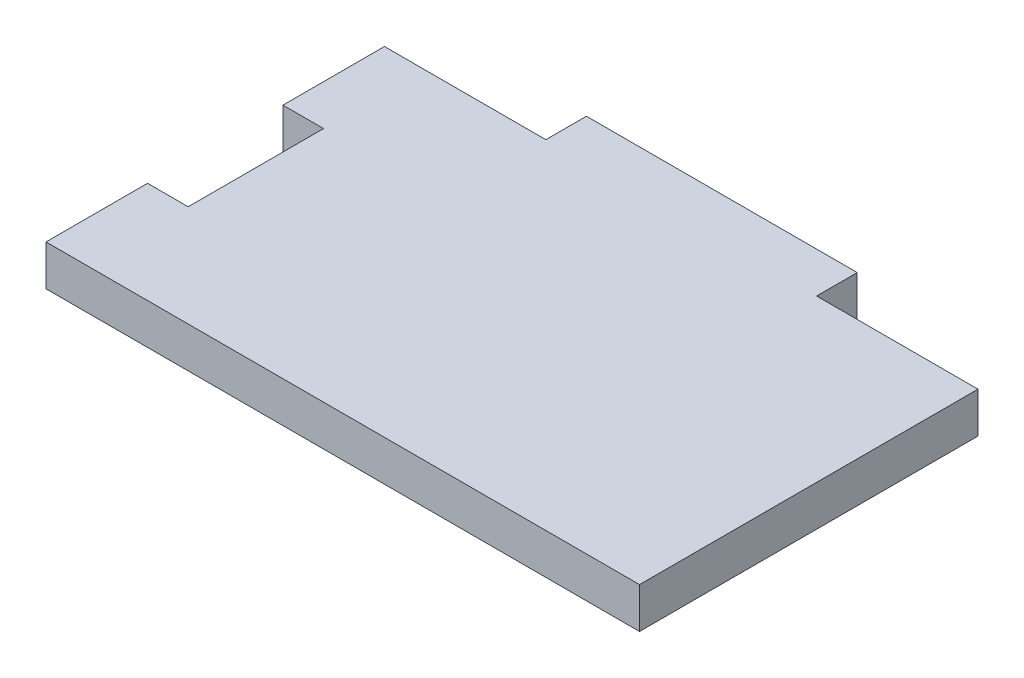
ISO-10303-21;
HEADER;
FILE_DESCRIPTION(('STEP AP214'),'2;1');
FILE_NAME('part.step','',(''),(''),'','','');
FILE_SCHEMA(('AUTOMOTIVE_DESIGN { 1 0 10303 214 1 1 1 1 }'));
ENDSEC;
DATA;
#1=APPLICATION_CONTEXT('core data for automotive mechanical design processes');
#2=APPLICATION_PROTOCOL_DEFINITION('international standard','automotive_design',2000,#1);
#3=PRODUCT_CONTEXT('',#1,'mechanical');
#4=PRODUCT('Part','Part','',(#3));
#5=PRODUCT_RELATED_PRODUCT_CATEGORY('part','',(#4));
#6=PRODUCT_DEFINITION_FORMATION('','',#4);
#7=PRODUCT_DEFINITION_CONTEXT('part definition',#1,'design');
#8=PRODUCT_DEFINITION('design','',#6,#7);
#9=PRODUCT_DEFINITION_SHAPE('','',#8);
#10=(LENGTH_UNIT() NAMED_UNIT(*) SI_UNIT(.MILLI.,.METRE.));
#11=(NAMED_UNIT(*) PLANE_ANGLE_UNIT() SI_UNIT($,.RADIAN.));
#12=(NAMED_UNIT(*) SI_UNIT($,.STERADIAN.) SOLID_ANGLE_UNIT());
#13=UNCERTAINTY_MEASURE_WITH_UNIT(LENGTH_MEASURE(1.E-05),#10,'distance_accuracy_value','');
#14=(GEOMETRIC_REPRESENTATION_CONTEXT(3) GLOBAL_UNCERTAINTY_ASSIGNED_CONTEXT((#13)) GLOBAL_UNIT_ASSIGNED_CONTEXT((#10,
#11,#12)) REPRESENTATION_CONTEXT('',''));
#15=CARTESIAN_POINT('',(0.,0.,0.));
#16=DIRECTION('',(0.,0.,1.));
#17=DIRECTION('',(1.,0.,0.));
#18=AXIS2_PLACEMENT_3D('',#15,#16,#17);
#19=CARTESIAN_POINT('',(-54.8558581563153,0.,50.));
#20=DIRECTION('',(-1.,0.,0.));
#21=DIRECTION('',(0.,0.,1.));
#22=AXIS2_PLACEMENT_3D('',#19,#20,#21);
#23=PLANE('',#22);
#24=DIRECTION('',(0.,1.,0.));
#25=VECTOR('',#24,1.);
#26=CARTESIAN_POINT('',(-54.8558581563153,-41.008278223877,15.));
#27=LINE('',#26,#25);
#28=CARTESIAN_POINT('',(-54.8558581563153,-41.008278223877,15.));
#29=VERTEX_POINT('',#28);
#30=CARTESIAN_POINT('',(-54.8558581563153,-35.008278223877,15.));
#31=VERTEX_POINT('',#30);
#32=EDGE_CURVE('E171',#29,#31,#27,.T.);
#33=ORIENTED_EDGE('',*,*,#32,.T.);
#34=DIRECTION('',(0.,0.,-1.));
#35=VECTOR('',#34,1.);
#36=CARTESIAN_POINT('',(-54.8558581563153,-35.008278223877,50.));
#37=LINE('',#36,#35);
#38=CARTESIAN_POINT('',(-54.8558581563153,-35.008278223877,0.));
#39=VERTEX_POINT('',#38);
#40=EDGE_CURVE('E246',#31,#39,#37,.T.);
#41=ORIENTED_EDGE('',*,*,#40,.T.);
#42=DIRECTION('',(0.,1.,0.));
#43=VECTOR('',#42,1.);
#44=CARTESIAN_POINT('',(-54.8558581563153,0.,0.));
#45=LINE('',#44,#43);
#46=CARTESIAN_POINT('',(-54.8558581563153,-41.008278223877,0.));
#47=VERTEX_POINT('',#46);
#48=EDGE_CURVE('E216',#47,#39,#45,.T.);
#49=ORIENTED_EDGE('',*,*,#48,.F.);
#50=DIRECTION('',(0.,0.,-1.));
#51=VECTOR('',#50,1.);
#52=CARTESIAN_POINT('',(-54.8558581563153,-41.008278223877,50.));
#53=LINE('',#52,#51);
#54=EDGE_CURVE('E227',#29,#47,#53,.T.);
#55=ORIENTED_EDGE('',*,*,#54,.F.);
#56=EDGE_LOOP('',(#33,#41,#49,#55));
#57=FACE_BOUND('',#56,.T.);
#58=ADVANCED_FACE('F45',(#57),#23,.T.);
#59=CARTESIAN_POINT('',(0.,0.,0.));
#60=DIRECTION('',(0.,0.,1.));
#61=DIRECTION('',(1.,0.,0.));
#62=AXIS2_PLACEMENT_3D('',#59,#60,#61);
#63=PLANE('',#62);
#64=DIRECTION('',(0.,-1.,0.));
#65=VECTOR('',#64,1.);
#66=CARTESIAN_POINT('',(8.98173698355886,0.,0.));
#67=LINE('',#66,#65);
#68=CARTESIAN_POINT('',(8.98173698355886,-35.008278223877,0.));
#69=VERTEX_POINT('',#68);
#70=CARTESIAN_POINT('',(8.98173698355886,-41.008278223877,0.));
#71=VERTEX_POINT('',#70);
#72=EDGE_CURVE('E175',#69,#71,#67,.T.);
#73=ORIENTED_EDGE('',*,*,#72,.F.);
#74=DIRECTION('',(1.,0.,0.));
#75=VECTOR('',#74,1.);
#76=CARTESIAN_POINT('',(0.,-35.008278223877,0.));
#77=LINE('',#76,#75);
#78=CARTESIAN_POINT('',(32.819332123433,-35.008278223877,0.));
#79=VERTEX_POINT('',#78);
#80=EDGE_CURVE('E236',#69,#79,#77,.T.);
#81=ORIENTED_EDGE('',*,*,#80,.T.);
#82=DIRECTION('',(0.,1.,0.));
#83=VECTOR('',#82,1.);
#84=CARTESIAN_POINT('',(32.819332123433,0.,0.));
#85=LINE('',#84,#83);
#86=CARTESIAN_POINT('',(32.819332123433,-41.008278223877,0.));
#87=VERTEX_POINT('',#86);
#88=EDGE_CURVE('E232',#87,#79,#85,.T.);
#89=ORIENTED_EDGE('',*,*,#88,.F.);
#90=DIRECTION('',(1.,0.,0.));
#91=VECTOR('',#90,1.);
#92=CARTESIAN_POINT('',(0.,-41.008278223877,0.));
#93=LINE('',#92,#91);
#94=EDGE_CURVE('E203',#71,#87,#93,.T.);
#95=ORIENTED_EDGE('',*,*,#94,.F.);
#96=EDGE_LOOP('',(#73,#81,#89,#95));
#97=FACE_BOUND('',#96,.T.);
#98=ADVANCED_FACE('F266',(#97),#63,.F.);
#99=CARTESIAN_POINT('',(0.,-41.008278223877,50.));
#100=DIRECTION('',(0.,1.,0.));
#101=DIRECTION('',(0.,0.,1.));
#102=AXIS2_PLACEMENT_3D('',#99,#100,#101);
#103=PLANE('',#102);
#104=DIRECTION('',(0.,0.,-1.));
#105=VECTOR('',#104,1.);
#106=CARTESIAN_POINT('',(-48.8558581563153,-41.008278223877,15.));
#107=LINE('',#106,#105);
#108=CARTESIAN_POINT('',(-48.8558581563153,-41.008278223877,35.));
#109=VERTEX_POINT('',#108);
#110=CARTESIAN_POINT('',(-48.8558581563153,-41.008278223877,15.));
#111=VERTEX_POINT('',#110);
#112=EDGE_CURVE('E147',#109,#111,#107,.T.);
#113=ORIENTED_EDGE('',*,*,#112,.T.);
#114=DIRECTION('',(-1.,0.,0.));
#115=VECTOR('',#114,1.);
#116=CARTESIAN_POINT('',(-54.8558581563153,-41.008278223877,15.));
#117=LINE('',#116,#115);
#118=EDGE_CURVE('E153',#111,#29,#117,.T.);
#119=ORIENTED_EDGE('',*,*,#118,.T.);
#120=ORIENTED_EDGE('',*,*,#54,.T.);
#121=CARTESIAN_POINT('',(-31.0182630164411,-41.008278223877,0.));
#122=VERTEX_POINT('',#121);
#123=EDGE_CURVE('E228',#47,#122,#93,.T.);
#124=ORIENTED_EDGE('',*,*,#123,.T.);
#125=DIRECTION('',(0.,0.,1.));
#126=VECTOR('',#125,1.);
#127=CARTESIAN_POINT('',(-31.0182630164411,-41.008278223877,-6.));
#128=LINE('',#127,#126);
#129=CARTESIAN_POINT('',(-31.0182630164411,-41.008278223877,-6.));
#130=VERTEX_POINT('',#129);
#131=EDGE_CURVE('E69',#130,#122,#128,.T.);
#132=ORIENTED_EDGE('',*,*,#131,.F.);
#133=DIRECTION('',(1.,0.,0.));
#134=VECTOR('',#133,1.);
#135=CARTESIAN_POINT('',(0.,-41.008278223877,-6.));
#136=LINE('',#135,#134);
#137=CARTESIAN_POINT('',(8.98173698355886,-41.008278223877,-6.));
#138=VERTEX_POINT('',#137);
#139=EDGE_CURVE('E190',#130,#138,#136,.T.);
#140=ORIENTED_EDGE('',*,*,#139,.T.);
#141=DIRECTION('',(0.,0.,1.));
#142=VECTOR('',#141,1.);
#143=CARTESIAN_POINT('',(8.98173698355886,-41.008278223877,-6.));
#144=LINE('',#143,#142);
#145=EDGE_CURVE('E200',#138,#71,#144,.T.);
#146=ORIENTED_EDGE('',*,*,#145,.T.);
#147=ORIENTED_EDGE('',*,*,#94,.T.);
#148=DIRECTION('',(0.,0.,-1.));
#149=VECTOR('',#148,1.);
#150=CARTESIAN_POINT('',(32.819332123433,-41.008278223877,50.));
#151=LINE('',#150,#149);
#152=CARTESIAN_POINT('',(32.819332123433,-41.008278223877,50.));
#153=VERTEX_POINT('',#152);
#154=EDGE_CURVE('E11',#153,#87,#151,.T.);
#155=ORIENTED_EDGE('',*,*,#154,.F.);
#156=DIRECTION('',(1.,0.,0.));
#157=VECTOR('',#156,1.);
#158=CARTESIAN_POINT('',(0.,-41.008278223877,50.));
#159=LINE('',#158,#157);
#160=CARTESIAN_POINT('',(-54.8558581563153,-41.008278223877,50.));
#161=VERTEX_POINT('',#160);
#162=EDGE_CURVE('E211',#161,#153,#159,.T.);
#163=ORIENTED_EDGE('',*,*,#162,.F.);
#164=CARTESIAN_POINT('',(-54.8558581563153,-41.008278223877,35.));
#165=VERTEX_POINT('',#164);
#166=EDGE_CURVE('E157',#161,#165,#53,.T.);
#167=ORIENTED_EDGE('',*,*,#166,.T.);
#168=DIRECTION('',(1.,0.,0.));
#169=VECTOR('',#168,1.);
#170=CARTESIAN_POINT('',(-54.8558581563153,-41.008278223877,35.));
#171=LINE('',#170,#169);
#172=EDGE_CURVE('E61',#165,#109,#171,.T.);
#173=ORIENTED_EDGE('',*,*,#172,.T.);
#174=EDGE_LOOP('',(#113,#119,#120,#124,#132,#140,#146,#147,#155,#163,#167,#173));
#175=FACE_BOUND('',#174,.T.);
#176=ADVANCED_FACE('F47',(#175),#103,.F.);
#177=CARTESIAN_POINT('',(32.819332123433,0.,50.));
#178=DIRECTION('',(-1.,0.,0.));
#179=DIRECTION('',(0.,0.,1.));
#180=AXIS2_PLACEMENT_3D('',#177,#178,#179);
#181=PLANE('',#180);
#182=ORIENTED_EDGE('',*,*,#88,.T.);
#183=DIRECTION('',(0.,0.,-1.));
#184=VECTOR('',#183,1.);
#185=CARTESIAN_POINT('',(32.819332123433,-35.008278223877,50.));
#186=LINE('',#185,#184);
#187=CARTESIAN_POINT('',(32.819332123433,-35.008278223877,50.));
#188=VERTEX_POINT('',#187);
#189=EDGE_CURVE('E54',#188,#79,#186,.T.);
#190=ORIENTED_EDGE('',*,*,#189,.F.);
#191=DIRECTION('',(0.,1.,0.));
#192=VECTOR('',#191,1.);
#193=CARTESIAN_POINT('',(32.819332123433,0.,50.));
#194=LINE('',#193,#192);
#195=EDGE_CURVE('E215',#153,#188,#194,.T.);
#196=ORIENTED_EDGE('',*,*,#195,.F.);
#197=ORIENTED_EDGE('',*,*,#154,.T.);
#198=EDGE_LOOP('',(#182,#190,#196,#197));
#199=FACE_BOUND('',#198,.T.);
#200=ADVANCED_FACE('F261',(#199),#181,.F.);
#201=CARTESIAN_POINT('',(0.,-35.008278223877,50.));
#202=DIRECTION('',(0.,1.,0.));
#203=DIRECTION('',(0.,0.,1.));
#204=AXIS2_PLACEMENT_3D('',#201,#202,#203);
#205=PLANE('',#204);
#206=DIRECTION('',(-1.,0.,0.));
#207=VECTOR('',#206,1.);
#208=CARTESIAN_POINT('',(-54.8558581563153,-35.008278223877,15.));
#209=LINE('',#208,#207);
#210=CARTESIAN_POINT('',(-48.8558581563153,-35.008278223877,15.));
#211=VERTEX_POINT('',#210);
#212=EDGE_CURVE('E159',#211,#31,#209,.T.);
#213=ORIENTED_EDGE('',*,*,#212,.F.);
#214=DIRECTION('',(0.,0.,-1.));
#215=VECTOR('',#214,1.);
#216=CARTESIAN_POINT('',(-48.8558581563153,-35.008278223877,15.));
#217=LINE('',#216,#215);
#218=CARTESIAN_POINT('',(-48.8558581563153,-35.008278223877,35.));
#219=VERTEX_POINT('',#218);
#220=EDGE_CURVE('E162',#219,#211,#217,.T.);
#221=ORIENTED_EDGE('',*,*,#220,.F.);
#222=DIRECTION('',(1.,0.,0.));
#223=VECTOR('',#222,1.);
#224=CARTESIAN_POINT('',(-54.8558581563153,-35.008278223877,35.));
#225=LINE('',#224,#223);
#226=CARTESIAN_POINT('',(-54.8558581563153,-35.008278223877,35.));
#227=VERTEX_POINT('',#226);
#228=EDGE_CURVE('E138',#227,#219,#225,.T.);
#229=ORIENTED_EDGE('',*,*,#228,.F.);
#230=CARTESIAN_POINT('',(-54.8558581563153,-35.008278223877,50.));
#231=VERTEX_POINT('',#230);
#232=EDGE_CURVE('E247',#231,#227,#37,.T.);
#233=ORIENTED_EDGE('',*,*,#232,.F.);
#234=DIRECTION('',(1.,0.,0.));
#235=VECTOR('',#234,1.);
#236=CARTESIAN_POINT('',(0.,-35.008278223877,50.));
#237=LINE('',#236,#235);
#238=EDGE_CURVE('E219',#231,#188,#237,.T.);
#239=ORIENTED_EDGE('',*,*,#238,.T.);
#240=ORIENTED_EDGE('',*,*,#189,.T.);
#241=ORIENTED_EDGE('',*,*,#80,.F.);
#242=DIRECTION('',(0.,0.,1.));
#243=VECTOR('',#242,1.);
#244=CARTESIAN_POINT('',(8.98173698355886,-35.008278223877,-6.));
#245=LINE('',#244,#243);
#246=CARTESIAN_POINT('',(8.98173698355886,-35.008278223877,-6.));
#247=VERTEX_POINT('',#246);
#248=EDGE_CURVE('E194',#247,#69,#245,.T.);
#249=ORIENTED_EDGE('',*,*,#248,.F.);
#250=DIRECTION('',(1.,0.,0.));
#251=VECTOR('',#250,1.);
#252=CARTESIAN_POINT('',(0.,-35.008278223877,-6.));
#253=LINE('',#252,#251);
#254=CARTESIAN_POINT('',(-31.0182630164411,-35.008278223877,-6.));
#255=VERTEX_POINT('',#254);
#256=EDGE_CURVE('E183',#255,#247,#253,.T.);
#257=ORIENTED_EDGE('',*,*,#256,.F.);
#258=DIRECTION('',(0.,0.,1.));
#259=VECTOR('',#258,1.);
#260=CARTESIAN_POINT('',(-31.0182630164411,-35.008278223877,-6.));
#261=LINE('',#260,#259);
#262=CARTESIAN_POINT('',(-31.0182630164411,-35.008278223877,0.));
#263=VERTEX_POINT('',#262);
#264=EDGE_CURVE('E206',#255,#263,#261,.T.);
#265=ORIENTED_EDGE('',*,*,#264,.T.);
#266=EDGE_CURVE('E237',#39,#263,#77,.T.);
#267=ORIENTED_EDGE('',*,*,#266,.F.);
#268=ORIENTED_EDGE('',*,*,#40,.F.);
#269=EDGE_LOOP('',(#213,#221,#229,#233,#239,#240,#241,#249,#257,#265,#267,#268));
#270=FACE_BOUND('',#269,.T.);
#271=ADVANCED_FACE('F256',(#270),#205,.T.);
#272=DIRECTION('',(0.,1.,0.));
#273=VECTOR('',#272,1.);
#274=CARTESIAN_POINT('',(-54.8558581563153,-41.008278223877,35.));
#275=LINE('',#274,#273);
#276=EDGE_CURVE('E144',#165,#227,#275,.T.);
#277=ORIENTED_EDGE('',*,*,#276,.F.);
#278=ORIENTED_EDGE('',*,*,#166,.F.);
#279=DIRECTION('',(0.,1.,0.));
#280=VECTOR('',#279,1.);
#281=CARTESIAN_POINT('',(-54.8558581563153,0.,50.));
#282=LINE('',#281,#280);
#283=EDGE_CURVE('E223',#161,#231,#282,.T.);
#284=ORIENTED_EDGE('',*,*,#283,.T.);
#285=ORIENTED_EDGE('',*,*,#232,.T.);
#286=EDGE_LOOP('',(#277,#278,#284,#285));
#287=FACE_BOUND('',#286,.T.);
#288=ADVANCED_FACE('F291',(#287),#23,.T.);
#289=CARTESIAN_POINT('',(0.,0.,50.));
#290=DIRECTION('',(0.,0.,1.));
#291=DIRECTION('',(1.,0.,0.));
#292=AXIS2_PLACEMENT_3D('',#289,#290,#291);
#293=PLANE('',#292);
#294=ORIENTED_EDGE('',*,*,#162,.T.);
#295=ORIENTED_EDGE('',*,*,#195,.T.);
#296=ORIENTED_EDGE('',*,*,#238,.F.);
#297=ORIENTED_EDGE('',*,*,#283,.F.);
#298=EDGE_LOOP('',(#294,#295,#296,#297));
#299=FACE_BOUND('',#298,.T.);
#300=ADVANCED_FACE('F298',(#299),#293,.T.);
#301=ORIENTED_EDGE('',*,*,#266,.T.);
#302=DIRECTION('',(0.,-1.,0.));
#303=VECTOR('',#302,1.);
#304=CARTESIAN_POINT('',(-31.0182630164411,0.,0.));
#305=LINE('',#304,#303);
#306=EDGE_CURVE('E184',#263,#122,#305,.T.);
#307=ORIENTED_EDGE('',*,*,#306,.T.);
#308=ORIENTED_EDGE('',*,*,#123,.F.);
#309=ORIENTED_EDGE('',*,*,#48,.T.);
#310=EDGE_LOOP('',(#301,#307,#308,#309));
#311=FACE_BOUND('',#310,.T.);
#312=ADVANCED_FACE('F282',(#311),#63,.F.);
#313=CARTESIAN_POINT('',(8.98173698355886,0.,-6.));
#314=DIRECTION('',(-1.,0.,0.));
#315=DIRECTION('',(0.,0.,1.));
#316=AXIS2_PLACEMENT_3D('',#313,#314,#315);
#317=PLANE('',#316);
#318=ORIENTED_EDGE('',*,*,#72,.T.);
#319=ORIENTED_EDGE('',*,*,#145,.F.);
#320=DIRECTION('',(0.,-1.,0.));
#321=VECTOR('',#320,1.);
#322=CARTESIAN_POINT('',(8.98173698355886,0.,-6.));
#323=LINE('',#322,#321);
#324=EDGE_CURVE('E180',#247,#138,#323,.T.);
#325=ORIENTED_EDGE('',*,*,#324,.F.);
#326=ORIENTED_EDGE('',*,*,#248,.T.);
#327=EDGE_LOOP('',(#318,#319,#325,#326));
#328=FACE_BOUND('',#327,.T.);
#329=ADVANCED_FACE('F273',(#328),#317,.F.);
#330=CARTESIAN_POINT('',(-31.0182630164411,0.,-6.));
#331=DIRECTION('',(-1.,0.,0.));
#332=DIRECTION('',(0.,0.,1.));
#333=AXIS2_PLACEMENT_3D('',#330,#331,#332);
#334=PLANE('',#333);
#335=ORIENTED_EDGE('',*,*,#306,.F.);
#336=ORIENTED_EDGE('',*,*,#264,.F.);
#337=DIRECTION('',(0.,-1.,0.));
#338=VECTOR('',#337,1.);
#339=CARTESIAN_POINT('',(-31.0182630164411,0.,-6.));
#340=LINE('',#339,#338);
#341=EDGE_CURVE('E187',#255,#130,#340,.T.);
#342=ORIENTED_EDGE('',*,*,#341,.T.);
#343=ORIENTED_EDGE('',*,*,#131,.T.);
#344=EDGE_LOOP('',(#335,#336,#342,#343));
#345=FACE_BOUND('',#344,.T.);
#346=ADVANCED_FACE('F279',(#345),#334,.T.);
#347=CARTESIAN_POINT('',(0.,0.,-6.));
#348=DIRECTION('',(0.,0.,1.));
#349=DIRECTION('',(1.,0.,0.));
#350=AXIS2_PLACEMENT_3D('',#347,#348,#349);
#351=PLANE('',#350);
#352=ORIENTED_EDGE('',*,*,#324,.T.);
#353=ORIENTED_EDGE('',*,*,#139,.F.);
#354=ORIENTED_EDGE('',*,*,#341,.F.);
#355=ORIENTED_EDGE('',*,*,#256,.T.);
#356=EDGE_LOOP('',(#352,#353,#354,#355));
#357=FACE_BOUND('',#356,.T.);
#358=ADVANCED_FACE('F278',(#357),#351,.F.);
#359=CARTESIAN_POINT('',(-54.8558581563153,-41.008278223877,15.));
#360=DIRECTION('',(0.,0.,-1.));
#361=DIRECTION('',(-1.,0.,0.));
#362=AXIS2_PLACEMENT_3D('',#359,#360,#361);
#363=PLANE('',#362);
#364=ORIENTED_EDGE('',*,*,#212,.T.);
#365=ORIENTED_EDGE('',*,*,#32,.F.);
#366=ORIENTED_EDGE('',*,*,#118,.F.);
#367=DIRECTION('',(0.,1.,0.));
#368=VECTOR('',#367,1.);
#369=CARTESIAN_POINT('',(-48.8558581563153,-41.008278223877,15.));
#370=LINE('',#369,#368);
#371=EDGE_CURVE('E143',#111,#211,#370,.T.);
#372=ORIENTED_EDGE('',*,*,#371,.T.);
#373=EDGE_LOOP('',(#364,#365,#366,#372));
#374=FACE_BOUND('',#373,.T.);
#375=ADVANCED_FACE('F359',(#374),#363,.F.);
#376=CARTESIAN_POINT('',(-48.8558581563153,-41.008278223877,15.));
#377=DIRECTION('',(1.,0.,0.));
#378=DIRECTION('',(0.,0.,-1.));
#379=AXIS2_PLACEMENT_3D('',#376,#377,#378);
#380=PLANE('',#379);
#381=ORIENTED_EDGE('',*,*,#220,.T.);
#382=ORIENTED_EDGE('',*,*,#371,.F.);
#383=ORIENTED_EDGE('',*,*,#112,.F.);
#384=DIRECTION('',(0.,1.,0.));
#385=VECTOR('',#384,1.);
#386=CARTESIAN_POINT('',(-48.8558581563153,-41.008278223877,35.));
#387=LINE('',#386,#385);
#388=EDGE_CURVE('E134',#109,#219,#387,.T.);
#389=ORIENTED_EDGE('',*,*,#388,.T.);
#390=EDGE_LOOP('',(#381,#382,#383,#389));
#391=FACE_BOUND('',#390,.T.);
#392=ADVANCED_FACE('F148',(#391),#380,.F.);
#393=CARTESIAN_POINT('',(-54.8558581563153,-41.008278223877,35.));
#394=DIRECTION('',(0.,0.,1.));
#395=DIRECTION('',(1.,0.,0.));
#396=AXIS2_PLACEMENT_3D('',#393,#394,#395);
#397=PLANE('',#396);
#398=ORIENTED_EDGE('',*,*,#228,.T.);
#399=ORIENTED_EDGE('',*,*,#388,.F.);
#400=ORIENTED_EDGE('',*,*,#172,.F.);
#401=ORIENTED_EDGE('',*,*,#276,.T.);
#402=EDGE_LOOP('',(#398,#399,#400,#401));
#403=FACE_BOUND('',#402,.T.);
#404=ADVANCED_FACE('F136',(#403),#397,.F.);
#405=CLOSED_SHELL('',(#58,#98,#176,#200,#271,#288,#300,#312,#329,#346,#358,#375,#392,#404));
#406=MANIFOLD_SOLID_BREP('B2',#405);
#407=ADVANCED_BREP_SHAPE_REPRESENTATION('',(#18,#406),#14);
#408=SHAPE_DEFINITION_REPRESENTATION(#9,#407);
ENDSEC;
END-ISO-10303-21;
